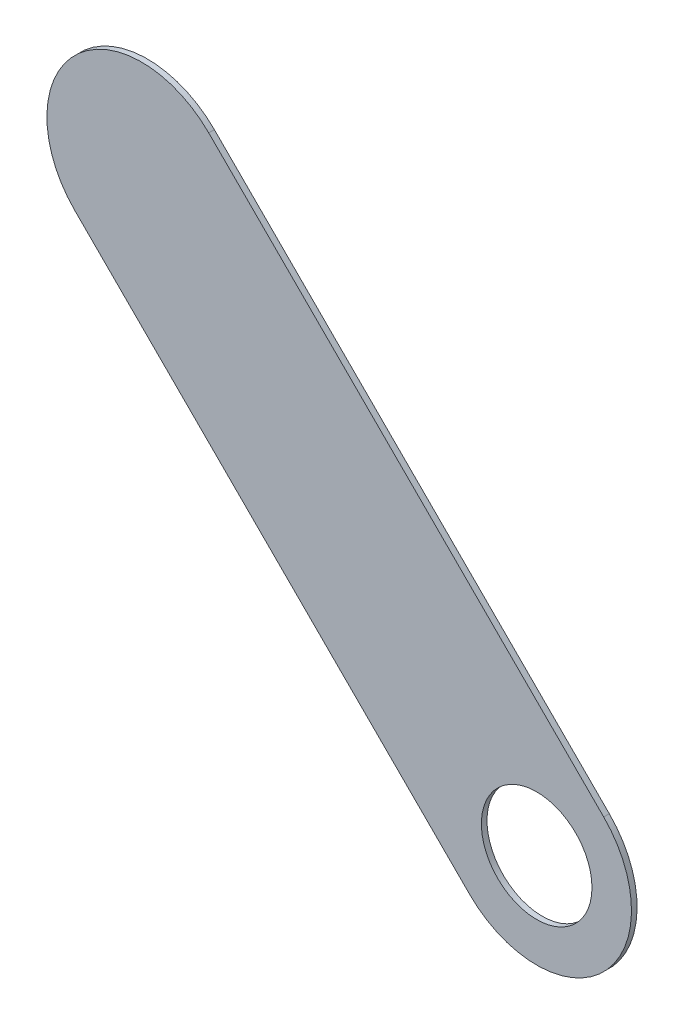
ISO-10303-21;
HEADER;
FILE_DESCRIPTION(('STEP AP214'),'2;1');
FILE_NAME('part.step','',(''),(''),'','','');
FILE_SCHEMA(('AUTOMOTIVE_DESIGN { 1 0 10303 214 1 1 1 1 }'));
ENDSEC;
DATA;
#1=APPLICATION_CONTEXT('core data for automotive mechanical design processes');
#2=APPLICATION_PROTOCOL_DEFINITION('international standard','automotive_design',2000,#1);
#3=PRODUCT_CONTEXT('',#1,'mechanical');
#4=PRODUCT('Part','Part','',(#3));
#5=PRODUCT_RELATED_PRODUCT_CATEGORY('part','',(#4));
#6=PRODUCT_DEFINITION_FORMATION('','',#4);
#7=PRODUCT_DEFINITION_CONTEXT('part definition',#1,'design');
#8=PRODUCT_DEFINITION('design','',#6,#7);
#9=PRODUCT_DEFINITION_SHAPE('','',#8);
#10=(LENGTH_UNIT() NAMED_UNIT(*) SI_UNIT(.MILLI.,.METRE.));
#11=(NAMED_UNIT(*) PLANE_ANGLE_UNIT() SI_UNIT($,.RADIAN.));
#12=(NAMED_UNIT(*) SI_UNIT($,.STERADIAN.) SOLID_ANGLE_UNIT());
#13=UNCERTAINTY_MEASURE_WITH_UNIT(LENGTH_MEASURE(1.E-05),#10,'distance_accuracy_value','');
#14=(GEOMETRIC_REPRESENTATION_CONTEXT(3) GLOBAL_UNCERTAINTY_ASSIGNED_CONTEXT((#13)) GLOBAL_UNIT_ASSIGNED_CONTEXT((#10,
#11,#12)) REPRESENTATION_CONTEXT('',''));
#15=CARTESIAN_POINT('',(0.,0.,0.));
#16=DIRECTION('',(0.,0.,1.));
#17=DIRECTION('',(1.,0.,0.));
#18=AXIS2_PLACEMENT_3D('',#15,#16,#17);
#19=CARTESIAN_POINT('',(35.47574058,48.11574578,0.));
#20=DIRECTION('',(0.707106781186548,0.707106781186548,0.));
#21=DIRECTION('',(0.707106781186548,-0.707106781186548,0.));
#22=AXIS2_PLACEMENT_3D('',#19,#20,#21);
#23=PLANE('',#22);
#24=DIRECTION('',(0.707106781186548,-0.707106781186548,0.));
#25=VECTOR('',#24,1.);
#26=CARTESIAN_POINT('',(35.47574058,48.11574578,0.03556));
#27=LINE('',#26,#25);
#28=CARTESIAN_POINT('',(35.47574058,48.11574578,0.03556));
#29=VERTEX_POINT('',#28);
#30=CARTESIAN_POINT('',(37.97576098,45.61572538,0.03556));
#31=VERTEX_POINT('',#30);
#32=EDGE_CURVE('E11',#29,#31,#27,.T.);
#33=ORIENTED_EDGE('',*,*,#32,.F.);
#34=DIRECTION('',(0.,0.,1.));
#35=VECTOR('',#34,1.);
#36=CARTESIAN_POINT('',(35.47574058,48.11574578,0.));
#37=LINE('',#36,#35);
#38=CARTESIAN_POINT('',(35.47574058,48.11574578,0.));
#39=VERTEX_POINT('',#38);
#40=EDGE_CURVE('E24',#39,#29,#37,.T.);
#41=ORIENTED_EDGE('',*,*,#40,.F.);
#42=DIRECTION('',(0.707106781186548,-0.707106781186548,0.));
#43=VECTOR('',#42,1.);
#44=CARTESIAN_POINT('',(35.47574058,48.11574578,0.));
#45=LINE('',#44,#43);
#46=CARTESIAN_POINT('',(37.97576098,45.61572538,0.));
#47=VERTEX_POINT('',#46);
#48=EDGE_CURVE('E96',#39,#47,#45,.T.);
#49=ORIENTED_EDGE('',*,*,#48,.T.);
#50=DIRECTION('',(0.,0.,1.));
#51=VECTOR('',#50,1.);
#52=CARTESIAN_POINT('',(37.97576098,45.61572538,0.));
#53=LINE('',#52,#51);
#54=EDGE_CURVE('E37',#47,#31,#53,.T.);
#55=ORIENTED_EDGE('',*,*,#54,.T.);
#56=EDGE_LOOP('',(#33,#41,#49,#55));
#57=FACE_BOUND('',#56,.T.);
#58=ADVANCED_FACE('F17',(#57),#23,.F.);
#59=CARTESIAN_POINT('',(35.9000044,48.5400096,0.));
#60=DIRECTION('',(0.,0.,-1.));
#61=DIRECTION('',(0.707106781186548,0.707106781186548,0.));
#62=AXIS2_PLACEMENT_3D('',#59,#60,#61);
#63=CYLINDRICAL_SURFACE('',#62,0.599999648268218);
#64=CARTESIAN_POINT('',(35.9000044,48.5400096,0.03556));
#65=DIRECTION('',(0.,0.,1.));
#66=DIRECTION('',(0.707106781186548,0.707106781186548,0.));
#67=AXIS2_PLACEMENT_3D('',#64,#65,#66);
#68=CIRCLE('',#67,0.599999648268218);
#69=CARTESIAN_POINT('',(36.32426822,48.96427342,0.03556));
#70=VERTEX_POINT('',#69);
#71=EDGE_CURVE('E92',#70,#29,#68,.T.);
#72=ORIENTED_EDGE('',*,*,#71,.F.);
#73=DIRECTION('',(0.,0.,1.));
#74=VECTOR('',#73,1.);
#75=CARTESIAN_POINT('',(36.32426822,48.96427342,0.));
#76=LINE('',#75,#74);
#77=CARTESIAN_POINT('',(36.32426822,48.96427342,0.));
#78=VERTEX_POINT('',#77);
#79=EDGE_CURVE('E90',#78,#70,#76,.T.);
#80=ORIENTED_EDGE('',*,*,#79,.F.);
#81=CARTESIAN_POINT('',(35.9000044,48.5400096,0.));
#82=DIRECTION('',(0.,0.,1.));
#83=DIRECTION('',(0.707106781186548,0.707106781186548,0.));
#84=AXIS2_PLACEMENT_3D('',#81,#82,#83);
#85=CIRCLE('',#84,0.599999648268218);
#86=EDGE_CURVE('E88',#78,#39,#85,.T.);
#87=ORIENTED_EDGE('',*,*,#86,.T.);
#88=ORIENTED_EDGE('',*,*,#40,.T.);
#89=EDGE_LOOP('',(#72,#80,#87,#88));
#90=FACE_BOUND('',#89,.T.);
#91=ADVANCED_FACE('F111',(#90),#63,.T.);
#92=CARTESIAN_POINT('',(38.4000248,46.0399892,0.));
#93=DIRECTION('',(0.,0.,-1.));
#94=DIRECTION('',(-0.707106781186548,-0.707106781186548,0.));
#95=AXIS2_PLACEMENT_3D('',#92,#93,#94);
#96=CYLINDRICAL_SURFACE('',#95,0.599999648268221);
#97=CARTESIAN_POINT('',(38.4000248,46.0399892,0.03556));
#98=DIRECTION('',(0.,0.,1.));
#99=DIRECTION('',(-0.707106781186548,-0.707106781186548,0.));
#100=AXIS2_PLACEMENT_3D('',#97,#98,#99);
#101=CIRCLE('',#100,0.599999648268221);
#102=CARTESIAN_POINT('',(38.82428862,46.46425302,0.03556));
#103=VERTEX_POINT('',#102);
#104=EDGE_CURVE('E85',#31,#103,#101,.T.);
#105=ORIENTED_EDGE('',*,*,#104,.F.);
#106=ORIENTED_EDGE('',*,*,#54,.F.);
#107=CARTESIAN_POINT('',(38.4000248,46.0399892,0.));
#108=DIRECTION('',(0.,0.,1.));
#109=DIRECTION('',(-0.707106781186548,-0.707106781186548,0.));
#110=AXIS2_PLACEMENT_3D('',#107,#108,#109);
#111=CIRCLE('',#110,0.599999648268221);
#112=CARTESIAN_POINT('',(38.82428862,46.46425302,0.));
#113=VERTEX_POINT('',#112);
#114=EDGE_CURVE('E82',#47,#113,#111,.T.);
#115=ORIENTED_EDGE('',*,*,#114,.T.);
#116=DIRECTION('',(0.,0.,1.));
#117=VECTOR('',#116,1.);
#118=CARTESIAN_POINT('',(38.82428862,46.46425302,0.));
#119=LINE('',#118,#117);
#120=EDGE_CURVE('E80',#113,#103,#119,.T.);
#121=ORIENTED_EDGE('',*,*,#120,.T.);
#122=EDGE_LOOP('',(#105,#106,#115,#121));
#123=FACE_BOUND('',#122,.T.);
#124=ADVANCED_FACE('F104',(#123),#96,.T.);
#125=CARTESIAN_POINT('',(38.82428862,46.46425302,0.));
#126=DIRECTION('',(-0.707106781186547,-0.707106781186549,0.));
#127=DIRECTION('',(-0.707106781186549,0.707106781186547,0.));
#128=AXIS2_PLACEMENT_3D('',#125,#126,#127);
#129=PLANE('',#128);
#130=DIRECTION('',(-0.707106781186549,0.707106781186546,0.));
#131=VECTOR('',#130,1.);
#132=CARTESIAN_POINT('',(38.82428862,46.46425302,0.03556));
#133=LINE('',#132,#131);
#134=EDGE_CURVE('E77',#103,#70,#133,.T.);
#135=ORIENTED_EDGE('',*,*,#134,.F.);
#136=ORIENTED_EDGE('',*,*,#120,.F.);
#137=DIRECTION('',(-0.707106781186549,0.707106781186546,0.));
#138=VECTOR('',#137,1.);
#139=CARTESIAN_POINT('',(38.82428862,46.46425302,0.));
#140=LINE('',#139,#138);
#141=EDGE_CURVE('E68',#113,#78,#140,.T.);
#142=ORIENTED_EDGE('',*,*,#141,.T.);
#143=ORIENTED_EDGE('',*,*,#79,.T.);
#144=EDGE_LOOP('',(#135,#136,#142,#143));
#145=FACE_BOUND('',#144,.T.);
#146=ADVANCED_FACE('F110',(#145),#129,.F.);
#147=CARTESIAN_POINT('',(38.4000248,46.0399892,0.));
#148=DIRECTION('',(0.,0.,-1.));
#149=DIRECTION('',(1.,0.,0.));
#150=AXIS2_PLACEMENT_3D('',#147,#148,#149);
#151=CYLINDRICAL_SURFACE('',#150,0.3499993);
#152=DIRECTION('',(0.,0.,1.));
#153=VECTOR('',#152,1.);
#154=CARTESIAN_POINT('',(38.7500241,46.0399892,0.));
#155=LINE('',#154,#153);
#156=CARTESIAN_POINT('',(38.7500241,46.0399892,0.));
#157=VERTEX_POINT('',#156);
#158=CARTESIAN_POINT('',(38.7500241,46.0399892,0.03556));
#159=VERTEX_POINT('',#158);
#160=EDGE_CURVE('E62',#157,#159,#155,.T.);
#161=ORIENTED_EDGE('',*,*,#160,.T.);
#162=CARTESIAN_POINT('',(38.4000248,46.0399892,0.03556));
#163=DIRECTION('',(0.,0.,1.));
#164=DIRECTION('',(1.,0.,0.));
#165=AXIS2_PLACEMENT_3D('',#162,#163,#164);
#166=CIRCLE('',#165,0.3499993);
#167=EDGE_CURVE('E67',#159,#159,#166,.T.);
#168=ORIENTED_EDGE('',*,*,#167,.T.);
#169=ORIENTED_EDGE('',*,*,#160,.F.);
#170=CARTESIAN_POINT('',(38.4000248,46.0399892,0.));
#171=DIRECTION('',(0.,0.,1.));
#172=DIRECTION('',(1.,0.,0.));
#173=AXIS2_PLACEMENT_3D('',#170,#171,#172);
#174=CIRCLE('',#173,0.3499993);
#175=EDGE_CURVE('E65',#157,#157,#174,.T.);
#176=ORIENTED_EDGE('',*,*,#175,.F.);
#177=EDGE_LOOP('',(#161,#168,#169,#176));
#178=FACE_BOUND('',#177,.T.);
#179=ADVANCED_FACE('F64',(#178),#151,.F.);
#180=CARTESIAN_POINT('',(35.47574058,48.11574578,0.));
#181=DIRECTION('',(0.,0.,-1.));
#182=DIRECTION('',(-1.,0.,0.));
#183=AXIS2_PLACEMENT_3D('',#180,#181,#182);
#184=PLANE('',#183);
#185=ORIENTED_EDGE('',*,*,#48,.F.);
#186=ORIENTED_EDGE('',*,*,#86,.F.);
#187=ORIENTED_EDGE('',*,*,#141,.F.);
#188=ORIENTED_EDGE('',*,*,#114,.F.);
#189=EDGE_LOOP('',(#185,#186,#187,#188));
#190=FACE_BOUND('',#189,.T.);
#191=ORIENTED_EDGE('',*,*,#175,.T.);
#192=EDGE_LOOP('',(#191));
#193=FACE_BOUND('',#192,.T.);
#194=ADVANCED_FACE('F71',(#190,#193),#184,.T.);
#195=CARTESIAN_POINT('',(35.47574058,48.11574578,0.03556));
#196=DIRECTION('',(0.,0.,-1.));
#197=DIRECTION('',(-1.,0.,0.));
#198=AXIS2_PLACEMENT_3D('',#195,#196,#197);
#199=PLANE('',#198);
#200=ORIENTED_EDGE('',*,*,#134,.T.);
#201=ORIENTED_EDGE('',*,*,#71,.T.);
#202=ORIENTED_EDGE('',*,*,#32,.T.);
#203=ORIENTED_EDGE('',*,*,#104,.T.);
#204=EDGE_LOOP('',(#200,#201,#202,#203));
#205=FACE_BOUND('',#204,.T.);
#206=ORIENTED_EDGE('',*,*,#167,.F.);
#207=EDGE_LOOP('',(#206));
#208=FACE_BOUND('',#207,.T.);
#209=ADVANCED_FACE('F107',(#205,#208),#199,.F.);
#210=CLOSED_SHELL('',(#58,#91,#124,#146,#179,#194,#209));
#211=MANIFOLD_SOLID_BREP('B1',#210);
#212=ADVANCED_BREP_SHAPE_REPRESENTATION('',(#18,#211),#14);
#213=SHAPE_DEFINITION_REPRESENTATION(#9,#212);
ENDSEC;
END-ISO-10303-21;
